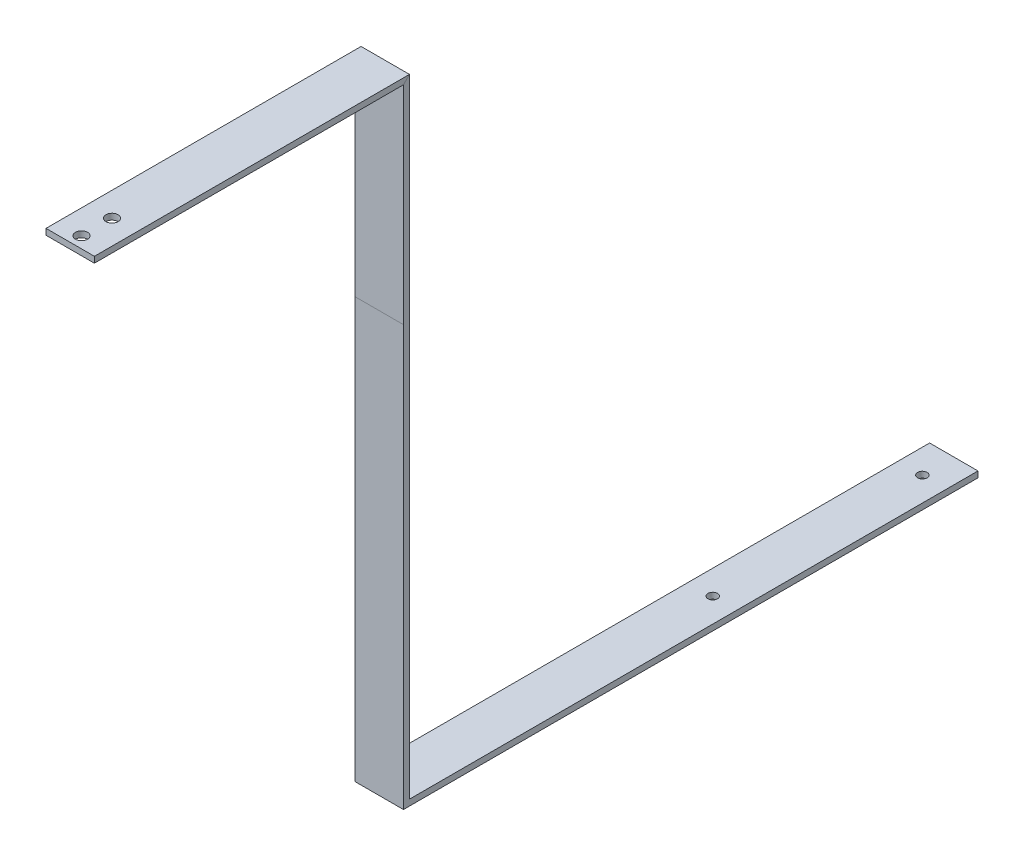
ISO-10303-21;
HEADER;
FILE_DESCRIPTION(('STEP AP214'),'2;1');
FILE_NAME('part.step','',(''),(''),'','','');
FILE_SCHEMA(('AUTOMOTIVE_DESIGN { 1 0 10303 214 1 1 1 1 }'));
ENDSEC;
DATA;
#1=APPLICATION_CONTEXT('core data for automotive mechanical design processes');
#2=APPLICATION_PROTOCOL_DEFINITION('international standard','automotive_design',2000,#1);
#3=PRODUCT_CONTEXT('',#1,'mechanical');
#4=PRODUCT('Part','Part','',(#3));
#5=PRODUCT_RELATED_PRODUCT_CATEGORY('part','',(#4));
#6=PRODUCT_DEFINITION_FORMATION('','',#4);
#7=PRODUCT_DEFINITION_CONTEXT('part definition',#1,'design');
#8=PRODUCT_DEFINITION('design','',#6,#7);
#9=PRODUCT_DEFINITION_SHAPE('','',#8);
#10=(LENGTH_UNIT() NAMED_UNIT(*) SI_UNIT(.MILLI.,.METRE.));
#11=(NAMED_UNIT(*) PLANE_ANGLE_UNIT() SI_UNIT($,.RADIAN.));
#12=(NAMED_UNIT(*) SI_UNIT($,.STERADIAN.) SOLID_ANGLE_UNIT());
#13=UNCERTAINTY_MEASURE_WITH_UNIT(LENGTH_MEASURE(1.E-05),#10,'distance_accuracy_value','');
#14=(GEOMETRIC_REPRESENTATION_CONTEXT(3) GLOBAL_UNCERTAINTY_ASSIGNED_CONTEXT((#13)) GLOBAL_UNIT_ASSIGNED_CONTEXT((#10,
#11,#12)) REPRESENTATION_CONTEXT('',''));
#15=CARTESIAN_POINT('',(0.,0.,0.));
#16=DIRECTION('',(0.,0.,1.));
#17=DIRECTION('',(1.,0.,0.));
#18=AXIS2_PLACEMENT_3D('',#15,#16,#17);
#19=CARTESIAN_POINT('',(-96.5999999999999,-272.07792076474,612.092449283312));
#20=DIRECTION('',(0.,-1.,0.));
#21=DIRECTION('',(0.,0.,-1.));
#22=AXIS2_PLACEMENT_3D('',#19,#20,#21);
#23=PLANE('',#22);
#24=DIRECTION('',(-1.,0.,0.));
#25=VECTOR('',#24,1.);
#26=CARTESIAN_POINT('',(-96.5999999999999,-272.07792076474,0.00397627219106411));
#27=LINE('',#26,#25);
#28=CARTESIAN_POINT('',(25.4,-272.07792076474,0.0039762721910086));
#29=VERTEX_POINT('',#28);
#30=CARTESIAN_POINT('',(-25.4,-272.07792076474,0.00397627219106411));
#31=VERTEX_POINT('',#30);
#32=EDGE_CURVE('E11',#29,#31,#27,.T.);
#33=ORIENTED_EDGE('',*,*,#32,.F.);
#34=DIRECTION('',(0.,0.,-1.));
#35=VECTOR('',#34,1.);
#36=CARTESIAN_POINT('',(25.4,-272.07792076474,612.092449283312));
#37=LINE('',#36,#35);
#38=CARTESIAN_POINT('',(25.4,-272.07792076474,0.));
#39=VERTEX_POINT('',#38);
#40=EDGE_CURVE('E165',#29,#39,#37,.T.);
#41=ORIENTED_EDGE('',*,*,#40,.T.);
#42=DIRECTION('',(1.,0.,0.));
#43=VECTOR('',#42,1.);
#44=CARTESIAN_POINT('',(0.,-272.07792076474,0.));
#45=LINE('',#44,#43);
#46=CARTESIAN_POINT('',(-25.4,-272.07792076474,0.));
#47=VERTEX_POINT('',#46);
#48=EDGE_CURVE('E282',#47,#39,#45,.T.);
#49=ORIENTED_EDGE('',*,*,#48,.F.);
#50=DIRECTION('',(0.,0.,-1.));
#51=VECTOR('',#50,1.);
#52=CARTESIAN_POINT('',(-25.4,-272.07792076474,574.));
#53=LINE('',#52,#51);
#54=EDGE_CURVE('E278',#31,#47,#53,.T.);
#55=ORIENTED_EDGE('',*,*,#54,.F.);
#56=EDGE_LOOP('',(#33,#41,#49,#55));
#57=FACE_BOUND('',#56,.T.);
#58=ADVANCED_FACE('F36',(#57),#23,.F.);
#59=CARTESIAN_POINT('',(25.4,3.155,574.));
#60=DIRECTION('',(-1.,0.,0.));
#61=DIRECTION('',(0.,0.,1.));
#62=AXIS2_PLACEMENT_3D('',#59,#60,#61);
#63=PLANE('',#62);
#64=DIRECTION('',(0.,1.,0.));
#65=VECTOR('',#64,1.);
#66=CARTESIAN_POINT('',(25.4,-278.803420764741,6.3139762721911));
#67=LINE('',#66,#65);
#68=CARTESIAN_POINT('',(25.4,-272.078734833776,6.31088055029496));
#69=VERTEX_POINT('',#68);
#70=CARTESIAN_POINT('',(25.4,-54.0479207647403,6.31397627219113));
#71=VERTEX_POINT('',#70);
#72=EDGE_CURVE('E179',#69,#71,#67,.T.);
#73=ORIENTED_EDGE('',*,*,#72,.F.);
#74=DIRECTION('',(0.,1.,0.));
#75=VECTOR('',#74,1.);
#76=CARTESIAN_POINT('',(25.4,-712.845,6.31000000000004));
#77=LINE('',#76,#75);
#78=CARTESIAN_POINT('',(25.4,-712.845,6.31000000000004));
#79=VERTEX_POINT('',#78);
#80=EDGE_CURVE('E40',#79,#69,#77,.T.);
#81=ORIENTED_EDGE('',*,*,#80,.F.);
#82=DIRECTION('',(0.,0.,-1.));
#83=VECTOR('',#82,1.);
#84=CARTESIAN_POINT('',(25.4,-712.845,0.));
#85=LINE('',#84,#83);
#86=CARTESIAN_POINT('',(25.4,-712.845,-596.7));
#87=VERTEX_POINT('',#86);
#88=EDGE_CURVE('E131',#79,#87,#85,.T.);
#89=ORIENTED_EDGE('',*,*,#88,.T.);
#90=DIRECTION('',(0.,1.,0.));
#91=VECTOR('',#90,1.);
#92=CARTESIAN_POINT('',(25.4,-706.535,-596.7));
#93=LINE('',#92,#91);
#94=CARTESIAN_POINT('',(25.4,-706.535,-596.7));
#95=VERTEX_POINT('',#94);
#96=EDGE_CURVE('E141',#87,#95,#93,.T.);
#97=ORIENTED_EDGE('',*,*,#96,.T.);
#98=DIRECTION('',(0.,0.,1.));
#99=VECTOR('',#98,1.);
#100=CARTESIAN_POINT('',(25.4,-706.535,-596.7));
#101=LINE('',#100,#99);
#102=CARTESIAN_POINT('',(25.4,-706.535,0.));
#103=VERTEX_POINT('',#102);
#104=EDGE_CURVE('E156',#95,#103,#101,.T.);
#105=ORIENTED_EDGE('',*,*,#104,.T.);
#106=DIRECTION('',(0.,1.,0.));
#107=VECTOR('',#106,1.);
#108=CARTESIAN_POINT('',(25.4,3.155,0.));
#109=LINE('',#108,#107);
#110=EDGE_CURVE('E54',#103,#39,#109,.T.);
#111=ORIENTED_EDGE('',*,*,#110,.T.);
#112=ORIENTED_EDGE('',*,*,#40,.F.);
#113=DIRECTION('',(0.,1.,0.));
#114=VECTOR('',#113,1.);
#115=CARTESIAN_POINT('',(25.4,-278.803420764741,0.0039762721910086));
#116=LINE('',#115,#114);
#117=CARTESIAN_POINT('',(25.4,-47.7379207647403,0.00397627219104076));
#118=VERTEX_POINT('',#117);
#119=EDGE_CURVE('E177',#29,#118,#116,.T.);
#120=ORIENTED_EDGE('',*,*,#119,.T.);
#121=DIRECTION('',(0.,0.707106781186548,-0.707106781186548));
#122=VECTOR('',#121,1.);
#123=CARTESIAN_POINT('',(25.4,-163.27067076474,115.536726272191));
#124=LINE('',#123,#122);
#125=EDGE_CURVE('E172',#71,#118,#124,.T.);
#126=ORIENTED_EDGE('',*,*,#125,.F.);
#127=EDGE_LOOP('',(#73,#81,#89,#97,#105,#111,#112,#120,#126));
#128=FACE_BOUND('',#127,.T.);
#129=ADVANCED_FACE('F38',(#128),#63,.F.);
#130=CARTESIAN_POINT('',(-25.4,3.155,574.));
#131=DIRECTION('',(1.,0.,0.));
#132=DIRECTION('',(0.,0.,-1.));
#133=AXIS2_PLACEMENT_3D('',#130,#131,#132);
#134=PLANE('',#133);
#135=DIRECTION('',(0.,-1.,0.));
#136=VECTOR('',#135,1.);
#137=CARTESIAN_POINT('',(-25.4,3.155,0.));
#138=LINE('',#137,#136);
#139=CARTESIAN_POINT('',(-25.4,-706.535,0.));
#140=VERTEX_POINT('',#139);
#141=EDGE_CURVE('E276',#47,#140,#138,.T.);
#142=ORIENTED_EDGE('',*,*,#141,.T.);
#143=DIRECTION('',(0.,0.,1.));
#144=VECTOR('',#143,1.);
#145=CARTESIAN_POINT('',(-25.4,-706.535,-596.7));
#146=LINE('',#145,#144);
#147=CARTESIAN_POINT('',(-25.4,-706.535,-596.7));
#148=VERTEX_POINT('',#147);
#149=EDGE_CURVE('E145',#148,#140,#146,.T.);
#150=ORIENTED_EDGE('',*,*,#149,.F.);
#151=DIRECTION('',(0.,-1.,0.));
#152=VECTOR('',#151,1.);
#153=CARTESIAN_POINT('',(-25.4,-706.535,-596.7));
#154=LINE('',#153,#152);
#155=CARTESIAN_POINT('',(-25.4,-712.845,-596.7));
#156=VERTEX_POINT('',#155);
#157=EDGE_CURVE('E138',#148,#156,#154,.T.);
#158=ORIENTED_EDGE('',*,*,#157,.T.);
#159=DIRECTION('',(0.,0.,1.));
#160=VECTOR('',#159,1.);
#161=CARTESIAN_POINT('',(-25.4,-712.845,0.));
#162=LINE('',#161,#160);
#163=CARTESIAN_POINT('',(-25.4,-712.845,6.31000000000004));
#164=VERTEX_POINT('',#163);
#165=EDGE_CURVE('E122',#156,#164,#162,.T.);
#166=ORIENTED_EDGE('',*,*,#165,.T.);
#167=DIRECTION('',(0.,1.,0.));
#168=VECTOR('',#167,1.);
#169=CARTESIAN_POINT('',(-25.4,-712.845,6.31000000000004));
#170=LINE('',#169,#168);
#171=CARTESIAN_POINT('',(-25.4,-272.078734833776,6.31088055029493));
#172=VERTEX_POINT('',#171);
#173=EDGE_CURVE('E264',#164,#172,#170,.T.);
#174=ORIENTED_EDGE('',*,*,#173,.T.);
#175=DIRECTION('',(0.,1.,0.));
#176=VECTOR('',#175,1.);
#177=CARTESIAN_POINT('',(-25.4,-278.803420764741,6.31397627219099));
#178=LINE('',#177,#176);
#179=CARTESIAN_POINT('',(-25.4,-54.0479207647402,6.31397627219104));
#180=VERTEX_POINT('',#179);
#181=EDGE_CURVE('E175',#172,#180,#178,.T.);
#182=ORIENTED_EDGE('',*,*,#181,.T.);
#183=DIRECTION('',(0.,-0.707106781186548,0.707106781186548));
#184=VECTOR('',#183,1.);
#185=CARTESIAN_POINT('',(-25.4,-163.27067076474,115.536726272191));
#186=LINE('',#185,#184);
#187=CARTESIAN_POINT('',(-25.4,-47.7379207647403,0.00397627219104109));
#188=VERTEX_POINT('',#187);
#189=EDGE_CURVE('E166',#188,#180,#186,.T.);
#190=ORIENTED_EDGE('',*,*,#189,.F.);
#191=DIRECTION('',(0.,1.,0.));
#192=VECTOR('',#191,1.);
#193=CARTESIAN_POINT('',(-25.4,-278.803420764741,0.0039762721910086));
#194=LINE('',#193,#192);
#195=EDGE_CURVE('E173',#31,#188,#194,.T.);
#196=ORIENTED_EDGE('',*,*,#195,.F.);
#197=ORIENTED_EDGE('',*,*,#54,.T.);
#198=EDGE_LOOP('',(#142,#150,#158,#166,#174,#182,#190,#196,#197));
#199=FACE_BOUND('',#198,.T.);
#200=ADVANCED_FACE('F143',(#199),#134,.F.);
#201=CARTESIAN_POINT('',(0.,0.,0.));
#202=DIRECTION('',(0.,0.,1.));
#203=DIRECTION('',(1.,0.,0.));
#204=AXIS2_PLACEMENT_3D('',#201,#202,#203);
#205=PLANE('',#204);
#206=ORIENTED_EDGE('',*,*,#110,.F.);
#207=DIRECTION('',(-1.,0.,0.));
#208=VECTOR('',#207,1.);
#209=CARTESIAN_POINT('',(0.,-706.535,0.));
#210=LINE('',#209,#208);
#211=EDGE_CURVE('E58',#103,#140,#210,.T.);
#212=ORIENTED_EDGE('',*,*,#211,.T.);
#213=ORIENTED_EDGE('',*,*,#141,.F.);
#214=ORIENTED_EDGE('',*,*,#48,.T.);
#215=EDGE_LOOP('',(#206,#212,#213,#214));
#216=FACE_BOUND('',#215,.T.);
#217=ADVANCED_FACE('F258',(#216),#205,.F.);
#218=CARTESIAN_POINT('',(-25.4,-712.845,6.31000000000004));
#219=DIRECTION('',(0.,0.,1.));
#220=DIRECTION('',(1.,0.,0.));
#221=AXIS2_PLACEMENT_3D('',#218,#219,#220);
#222=PLANE('',#221);
#223=CARTESIAN_POINT('',(-25.4,-272.07792076474,6.31397627219099));
#224=DIRECTION('',(1.,0.,0.));
#225=VECTOR('',#224,1.);
#226=LINE('',#223,#225);
#227=EDGE_CURVE('E46',#172,#69,#226,.T.);
#228=ORIENTED_EDGE('',*,*,#227,.F.);
#229=ORIENTED_EDGE('',*,*,#173,.F.);
#230=DIRECTION('',(1.,0.,0.));
#231=VECTOR('',#230,1.);
#232=CARTESIAN_POINT('',(-25.4,-712.845,6.31000000000004));
#233=LINE('',#232,#231);
#234=EDGE_CURVE('E128',#164,#79,#233,.T.);
#235=ORIENTED_EDGE('',*,*,#234,.T.);
#236=ORIENTED_EDGE('',*,*,#80,.T.);
#237=EDGE_LOOP('',(#228,#229,#235,#236));
#238=FACE_BOUND('',#237,.T.);
#239=ADVANCED_FACE('F253',(#238),#222,.T.);
#240=CARTESIAN_POINT('',(0.,-712.845,0.));
#241=DIRECTION('',(0.,1.,0.));
#242=DIRECTION('',(0.,0.,1.));
#243=AXIS2_PLACEMENT_3D('',#240,#241,#242);
#244=PLANE('',#243);
#245=CARTESIAN_POINT('',(0.,-712.845,-343.7));
#246=DIRECTION('',(0.,1.,0.));
#247=DIRECTION('',(0.,0.,1.));
#248=AXIS2_PLACEMENT_3D('',#245,#246,#247);
#249=CIRCLE('',#248,5.);
#250=CARTESIAN_POINT('',(0.,-712.845,-338.7));
#251=VERTEX_POINT('',#250);
#252=EDGE_CURVE('E488',#251,#251,#249,.T.);
#253=ORIENTED_EDGE('',*,*,#252,.T.);
#254=EDGE_LOOP('',(#253));
#255=FACE_BOUND('',#254,.T.);
#256=CARTESIAN_POINT('',(0.,-712.845,-563.7));
#257=DIRECTION('',(0.,1.,0.));
#258=DIRECTION('',(0.,0.,1.));
#259=AXIS2_PLACEMENT_3D('',#256,#257,#258);
#260=CIRCLE('',#259,5.);
#261=CARTESIAN_POINT('',(0.,-712.845,-558.7));
#262=VERTEX_POINT('',#261);
#263=EDGE_CURVE('E492',#262,#262,#260,.T.);
#264=ORIENTED_EDGE('',*,*,#263,.T.);
#265=EDGE_LOOP('',(#264));
#266=FACE_BOUND('',#265,.T.);
#267=ORIENTED_EDGE('',*,*,#88,.F.);
#268=ORIENTED_EDGE('',*,*,#234,.F.);
#269=ORIENTED_EDGE('',*,*,#165,.F.);
#270=DIRECTION('',(1.,0.,0.));
#271=VECTOR('',#270,1.);
#272=CARTESIAN_POINT('',(25.4,-712.845,-596.7));
#273=LINE('',#272,#271);
#274=EDGE_CURVE('E126',#156,#87,#273,.T.);
#275=ORIENTED_EDGE('',*,*,#274,.T.);
#276=EDGE_LOOP('',(#267,#268,#269,#275));
#277=FACE_BOUND('',#276,.T.);
#278=ADVANCED_FACE('F125',(#255,#266,#277),#244,.F.);
#279=CARTESIAN_POINT('',(-25.4,-278.803420764741,0.0039762721910086));
#280=DIRECTION('',(0.,0.,1.));
#281=DIRECTION('',(1.,0.,0.));
#282=AXIS2_PLACEMENT_3D('',#279,#280,#281);
#283=PLANE('',#282);
#284=ORIENTED_EDGE('',*,*,#119,.F.);
#285=ORIENTED_EDGE('',*,*,#32,.T.);
#286=ORIENTED_EDGE('',*,*,#195,.T.);
#287=DIRECTION('',(-1.,0.,0.));
#288=VECTOR('',#287,1.);
#289=CARTESIAN_POINT('',(-25.4,-47.7379207647402,0.0039762721910086));
#290=LINE('',#289,#288);
#291=EDGE_CURVE('E169',#118,#188,#290,.T.);
#292=ORIENTED_EDGE('',*,*,#291,.F.);
#293=EDGE_LOOP('',(#284,#285,#286,#292));
#294=FACE_BOUND('',#293,.T.);
#295=ADVANCED_FACE('F224',(#294),#283,.F.);
#296=CARTESIAN_POINT('',(0.,-326.125841529481,330.698976272191));
#297=DIRECTION('',(0.,0.,1.));
#298=DIRECTION('',(-1.,0.,0.));
#299=AXIS2_PLACEMENT_3D('',#296,#297,#298);
#300=PLANE('',#299);
#301=DIRECTION('',(0.,-1.,0.));
#302=VECTOR('',#301,1.);
#303=CARTESIAN_POINT('',(25.4,-47.7379207647403,330.698976272191));
#304=LINE('',#303,#302);
#305=CARTESIAN_POINT('',(25.4,-47.7379207647403,330.698976272191));
#306=VERTEX_POINT('',#305);
#307=CARTESIAN_POINT('',(25.4,-54.0479207647404,330.698976272191));
#308=VERTEX_POINT('',#307);
#309=EDGE_CURVE('E187',#306,#308,#304,.T.);
#310=ORIENTED_EDGE('',*,*,#309,.F.);
#311=DIRECTION('',(1.,0.,0.));
#312=VECTOR('',#311,1.);
#313=CARTESIAN_POINT('',(-25.4,-47.7379207647403,330.698976272191));
#314=LINE('',#313,#312);
#315=CARTESIAN_POINT('',(-25.4,-47.7379207647403,330.698976272191));
#316=VERTEX_POINT('',#315);
#317=EDGE_CURVE('E161',#316,#306,#314,.T.);
#318=ORIENTED_EDGE('',*,*,#317,.F.);
#319=DIRECTION('',(0.,1.,0.));
#320=VECTOR('',#319,1.);
#321=CARTESIAN_POINT('',(-25.4,-47.7379207647403,330.698976272191));
#322=LINE('',#321,#320);
#323=CARTESIAN_POINT('',(-25.4,-54.0479207647402,330.698976272191));
#324=VERTEX_POINT('',#323);
#325=EDGE_CURVE('E183',#324,#316,#322,.T.);
#326=ORIENTED_EDGE('',*,*,#325,.F.);
#327=DIRECTION('',(-1.,0.,0.));
#328=VECTOR('',#327,1.);
#329=CARTESIAN_POINT('',(-25.4,-54.0479207647402,330.698976272191));
#330=LINE('',#329,#328);
#331=EDGE_CURVE('E185',#308,#324,#330,.T.);
#332=ORIENTED_EDGE('',*,*,#331,.F.);
#333=EDGE_LOOP('',(#310,#318,#326,#332));
#334=FACE_BOUND('',#333,.T.);
#335=ADVANCED_FACE('F228',(#334),#300,.T.);
#336=CARTESIAN_POINT('',(25.4,-47.7379207647403,-0.411523727808952));
#337=DIRECTION('',(-1.,0.,0.));
#338=DIRECTION('',(0.,-1.,0.));
#339=AXIS2_PLACEMENT_3D('',#336,#337,#338);
#340=PLANE('',#339);
#341=ORIENTED_EDGE('',*,*,#125,.T.);
#342=DIRECTION('',(0.,0.,1.));
#343=VECTOR('',#342,1.);
#344=CARTESIAN_POINT('',(25.4,-47.7379207647403,-0.411523727808952));
#345=LINE('',#344,#343);
#346=EDGE_CURVE('E176',#118,#306,#345,.T.);
#347=ORIENTED_EDGE('',*,*,#346,.T.);
#348=ORIENTED_EDGE('',*,*,#309,.T.);
#349=DIRECTION('',(0.,0.,1.));
#350=VECTOR('',#349,1.);
#351=CARTESIAN_POINT('',(25.4,-54.0479207647404,-0.411523727808951));
#352=LINE('',#351,#350);
#353=EDGE_CURVE('E195',#71,#308,#352,.T.);
#354=ORIENTED_EDGE('',*,*,#353,.F.);
#355=EDGE_LOOP('',(#341,#347,#348,#354));
#356=FACE_BOUND('',#355,.T.);
#357=ADVANCED_FACE('F230',(#356),#340,.F.);
#358=CARTESIAN_POINT('',(-25.4,-54.0479207647402,-0.411523727808951));
#359=DIRECTION('',(0.,1.,0.));
#360=DIRECTION('',(-1.,0.,0.));
#361=AXIS2_PLACEMENT_3D('',#358,#359,#360);
#362=PLANE('',#361);
#363=CARTESIAN_POINT('',(0.,-54.0479207647403,286.806771606458));
#364=DIRECTION('',(0.,1.,0.));
#365=DIRECTION('',(-1.,0.,0.));
#366=AXIS2_PLACEMENT_3D('',#363,#364,#365);
#367=CIRCLE('',#366,6.34999999999226);
#368=CARTESIAN_POINT('',(-6.34999999999225,-54.0479207647403,286.806771606458));
#369=VERTEX_POINT('',#368);
#370=EDGE_CURVE('E501',#369,#369,#367,.T.);
#371=ORIENTED_EDGE('',*,*,#370,.T.);
#372=EDGE_LOOP('',(#371));
#373=FACE_BOUND('',#372,.T.);
#374=CARTESIAN_POINT('',(0.,-54.0479207647403,318.806771606458));
#375=DIRECTION('',(0.,1.,0.));
#376=DIRECTION('',(-1.,0.,0.));
#377=AXIS2_PLACEMENT_3D('',#374,#375,#376);
#378=CIRCLE('',#377,6.34999999999129);
#379=CARTESIAN_POINT('',(-6.34999999999127,-54.0479207647403,318.806771606458));
#380=VERTEX_POINT('',#379);
#381=EDGE_CURVE('E146',#380,#380,#378,.T.);
#382=ORIENTED_EDGE('',*,*,#381,.T.);
#383=EDGE_LOOP('',(#382));
#384=FACE_BOUND('',#383,.T.);
#385=DIRECTION('',(1.,0.,0.));
#386=VECTOR('',#385,1.);
#387=CARTESIAN_POINT('',(-25.3999999999995,-54.0479207647402,6.31397627219099));
#388=LINE('',#387,#386);
#389=EDGE_CURVE('E162',#180,#71,#388,.T.);
#390=ORIENTED_EDGE('',*,*,#389,.T.);
#391=ORIENTED_EDGE('',*,*,#353,.T.);
#392=ORIENTED_EDGE('',*,*,#331,.T.);
#393=DIRECTION('',(0.,0.,1.));
#394=VECTOR('',#393,1.);
#395=CARTESIAN_POINT('',(-25.4,-54.0479207647402,-0.411523727808951));
#396=LINE('',#395,#394);
#397=EDGE_CURVE('E192',#180,#324,#396,.T.);
#398=ORIENTED_EDGE('',*,*,#397,.F.);
#399=EDGE_LOOP('',(#390,#391,#392,#398));
#400=FACE_BOUND('',#399,.T.);
#401=ADVANCED_FACE('F233',(#373,#384,#400),#362,.F.);
#402=CARTESIAN_POINT('',(-25.4,-47.7379207647403,-0.411523727808952));
#403=DIRECTION('',(1.,0.,0.));
#404=DIRECTION('',(0.,1.,0.));
#405=AXIS2_PLACEMENT_3D('',#402,#403,#404);
#406=PLANE('',#405);
#407=ORIENTED_EDGE('',*,*,#189,.T.);
#408=ORIENTED_EDGE('',*,*,#397,.T.);
#409=ORIENTED_EDGE('',*,*,#325,.T.);
#410=DIRECTION('',(0.,0.,1.));
#411=VECTOR('',#410,1.);
#412=CARTESIAN_POINT('',(-25.4,-47.7379207647403,-0.411523727808952));
#413=LINE('',#412,#411);
#414=EDGE_CURVE('E189',#188,#316,#413,.T.);
#415=ORIENTED_EDGE('',*,*,#414,.F.);
#416=EDGE_LOOP('',(#407,#408,#409,#415));
#417=FACE_BOUND('',#416,.T.);
#418=ADVANCED_FACE('F237',(#417),#406,.F.);
#419=CARTESIAN_POINT('',(-25.4,-47.7379207647403,-0.411523727808952));
#420=DIRECTION('',(0.,-1.,0.));
#421=DIRECTION('',(1.,0.,0.));
#422=AXIS2_PLACEMENT_3D('',#419,#420,#421);
#423=PLANE('',#422);
#424=CARTESIAN_POINT('',(0.,-47.7379207647403,286.806771606458));
#425=DIRECTION('',(0.,1.,0.));
#426=DIRECTION('',(-1.,0.,0.));
#427=AXIS2_PLACEMENT_3D('',#424,#425,#426);
#428=CIRCLE('',#427,6.34999999999226);
#429=CARTESIAN_POINT('',(-6.34999999999225,-47.7379207647403,286.806771606458));
#430=VERTEX_POINT('',#429);
#431=EDGE_CURVE('E498',#430,#430,#428,.T.);
#432=ORIENTED_EDGE('',*,*,#431,.F.);
#433=EDGE_LOOP('',(#432));
#434=FACE_BOUND('',#433,.T.);
#435=CARTESIAN_POINT('',(0.,-47.7379207647403,318.806771606458));
#436=DIRECTION('',(0.,1.,0.));
#437=DIRECTION('',(-1.,0.,0.));
#438=AXIS2_PLACEMENT_3D('',#435,#436,#437);
#439=CIRCLE('',#438,6.34999999999129);
#440=CARTESIAN_POINT('',(-6.34999999999127,-47.7379207647403,318.806771606458));
#441=VERTEX_POINT('',#440);
#442=EDGE_CURVE('E149',#441,#441,#439,.T.);
#443=ORIENTED_EDGE('',*,*,#442,.F.);
#444=EDGE_LOOP('',(#443));
#445=FACE_BOUND('',#444,.T.);
#446=ORIENTED_EDGE('',*,*,#291,.T.);
#447=ORIENTED_EDGE('',*,*,#414,.T.);
#448=ORIENTED_EDGE('',*,*,#317,.T.);
#449=ORIENTED_EDGE('',*,*,#346,.F.);
#450=EDGE_LOOP('',(#446,#447,#448,#449));
#451=FACE_BOUND('',#450,.T.);
#452=ADVANCED_FACE('F223',(#434,#445,#451),#423,.F.);
#453=CARTESIAN_POINT('',(-25.4,-278.803420764741,6.31397627219099));
#454=DIRECTION('',(0.,0.,-1.));
#455=DIRECTION('',(-1.,0.,0.));
#456=AXIS2_PLACEMENT_3D('',#453,#454,#455);
#457=PLANE('',#456);
#458=ORIENTED_EDGE('',*,*,#181,.F.);
#459=ORIENTED_EDGE('',*,*,#227,.T.);
#460=ORIENTED_EDGE('',*,*,#72,.T.);
#461=ORIENTED_EDGE('',*,*,#389,.F.);
#462=EDGE_LOOP('',(#458,#459,#460,#461));
#463=FACE_BOUND('',#462,.T.);
#464=ADVANCED_FACE('F212',(#463),#457,.F.);
#465=CARTESIAN_POINT('',(25.4,-706.535,-596.7));
#466=DIRECTION('',(0.,1.,0.));
#467=DIRECTION('',(0.,0.,1.));
#468=AXIS2_PLACEMENT_3D('',#465,#466,#467);
#469=PLANE('',#468);
#470=CARTESIAN_POINT('',(0.,-706.535,-343.7));
#471=DIRECTION('',(0.,1.,0.));
#472=DIRECTION('',(0.,0.,1.));
#473=AXIS2_PLACEMENT_3D('',#470,#471,#472);
#474=CIRCLE('',#473,5.);
#475=CARTESIAN_POINT('',(0.,-706.535,-338.7));
#476=VERTEX_POINT('',#475);
#477=EDGE_CURVE('E485',#476,#476,#474,.T.);
#478=ORIENTED_EDGE('',*,*,#477,.F.);
#479=EDGE_LOOP('',(#478));
#480=FACE_BOUND('',#479,.T.);
#481=CARTESIAN_POINT('',(0.,-706.535,-563.7));
#482=DIRECTION('',(0.,1.,0.));
#483=DIRECTION('',(0.,0.,1.));
#484=AXIS2_PLACEMENT_3D('',#481,#482,#483);
#485=CIRCLE('',#484,5.);
#486=CARTESIAN_POINT('',(0.,-706.535,-558.7));
#487=VERTEX_POINT('',#486);
#488=EDGE_CURVE('E489',#487,#487,#485,.T.);
#489=ORIENTED_EDGE('',*,*,#488,.F.);
#490=EDGE_LOOP('',(#489));
#491=FACE_BOUND('',#490,.T.);
#492=ORIENTED_EDGE('',*,*,#211,.F.);
#493=ORIENTED_EDGE('',*,*,#104,.F.);
#494=DIRECTION('',(-1.,0.,0.));
#495=VECTOR('',#494,1.);
#496=CARTESIAN_POINT('',(25.4,-706.535,-596.7));
#497=LINE('',#496,#495);
#498=EDGE_CURVE('E154',#95,#148,#497,.T.);
#499=ORIENTED_EDGE('',*,*,#498,.T.);
#500=ORIENTED_EDGE('',*,*,#149,.T.);
#501=EDGE_LOOP('',(#492,#493,#499,#500));
#502=FACE_BOUND('',#501,.T.);
#503=ADVANCED_FACE('F222',(#480,#491,#502),#469,.T.);
#504=CARTESIAN_POINT('',(0.,0.,-596.7));
#505=DIRECTION('',(0.,0.,-1.));
#506=DIRECTION('',(-1.,0.,0.));
#507=AXIS2_PLACEMENT_3D('',#504,#505,#506);
#508=PLANE('',#507);
#509=ORIENTED_EDGE('',*,*,#157,.F.);
#510=ORIENTED_EDGE('',*,*,#498,.F.);
#511=ORIENTED_EDGE('',*,*,#96,.F.);
#512=ORIENTED_EDGE('',*,*,#274,.F.);
#513=EDGE_LOOP('',(#509,#510,#511,#512));
#514=FACE_BOUND('',#513,.T.);
#515=ADVANCED_FACE('F136',(#514),#508,.T.);
#516=CARTESIAN_POINT('',(0.,-57.7379207647403,318.806771606458));
#517=DIRECTION('',(0.,1.,0.));
#518=DIRECTION('',(-1.,0.,0.));
#519=AXIS2_PLACEMENT_3D('',#516,#517,#518);
#520=CYLINDRICAL_SURFACE('',#519,6.34999999999129);
#521=ORIENTED_EDGE('',*,*,#442,.T.);
#522=EDGE_LOOP('',(#521));
#523=FACE_BOUND('',#522,.T.);
#524=ORIENTED_EDGE('',*,*,#381,.F.);
#525=EDGE_LOOP('',(#524));
#526=FACE_BOUND('',#525,.T.);
#527=ADVANCED_FACE('F379',(#523,#526),#520,.F.);
#528=CARTESIAN_POINT('',(0.,-57.7379207647403,286.806771606458));
#529=DIRECTION('',(0.,1.,0.));
#530=DIRECTION('',(-1.,0.,0.));
#531=AXIS2_PLACEMENT_3D('',#528,#529,#530);
#532=CYLINDRICAL_SURFACE('',#531,6.34999999999226);
#533=ORIENTED_EDGE('',*,*,#431,.T.);
#534=EDGE_LOOP('',(#533));
#535=FACE_BOUND('',#534,.T.);
#536=ORIENTED_EDGE('',*,*,#370,.F.);
#537=EDGE_LOOP('',(#536));
#538=FACE_BOUND('',#537,.T.);
#539=ADVANCED_FACE('F385',(#535,#538),#532,.F.);
#540=CARTESIAN_POINT('',(0.,-716.535,-563.7));
#541=DIRECTION('',(0.,1.,0.));
#542=DIRECTION('',(0.,0.,1.));
#543=AXIS2_PLACEMENT_3D('',#540,#541,#542);
#544=CYLINDRICAL_SURFACE('',#543,5.);
#545=ORIENTED_EDGE('',*,*,#488,.T.);
#546=EDGE_LOOP('',(#545));
#547=FACE_BOUND('',#546,.T.);
#548=ORIENTED_EDGE('',*,*,#263,.F.);
#549=EDGE_LOOP('',(#548));
#550=FACE_BOUND('',#549,.T.);
#551=ADVANCED_FACE('F393',(#547,#550),#544,.F.);
#552=CARTESIAN_POINT('',(0.,-716.535,-343.7));
#553=DIRECTION('',(0.,1.,0.));
#554=DIRECTION('',(0.,0.,1.));
#555=AXIS2_PLACEMENT_3D('',#552,#553,#554);
#556=CYLINDRICAL_SURFACE('',#555,5.);
#557=ORIENTED_EDGE('',*,*,#477,.T.);
#558=EDGE_LOOP('',(#557));
#559=FACE_BOUND('',#558,.T.);
#560=ORIENTED_EDGE('',*,*,#252,.F.);
#561=EDGE_LOOP('',(#560));
#562=FACE_BOUND('',#561,.T.);
#563=ADVANCED_FACE('F400',(#559,#562),#556,.F.);
#564=CLOSED_SHELL('',(#58,#129,#200,#217,#239,#278,#295,#335,#357,#401,#418,#452,#464,#503,#515,
#527,#539,#551,#563));
#565=MANIFOLD_SOLID_BREP('B2',#564);
#566=ADVANCED_BREP_SHAPE_REPRESENTATION('',(#18,#565),#14);
#567=SHAPE_DEFINITION_REPRESENTATION(#9,#566);
ENDSEC;
END-ISO-10303-21;
